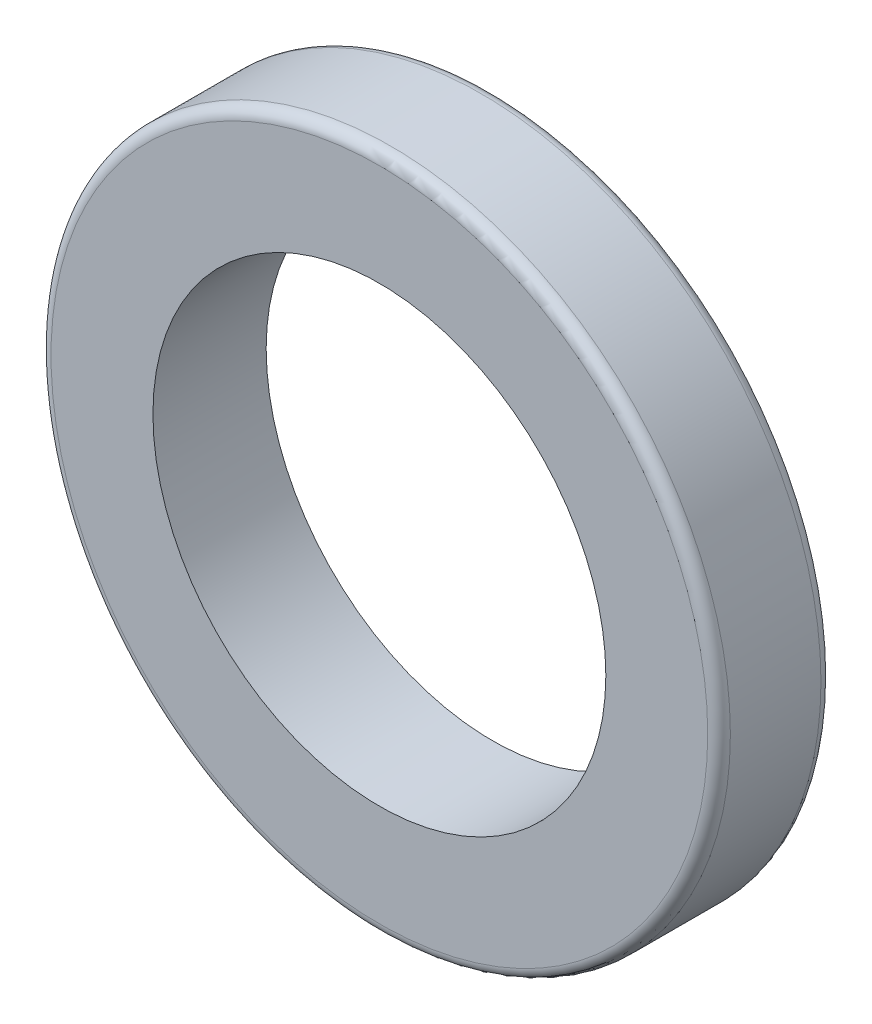
ISO-10303-21;
HEADER;
FILE_DESCRIPTION(('STEP AP214'),'2;1');
FILE_NAME('part.step','',(''),(''),'','','');
FILE_SCHEMA(('AUTOMOTIVE_DESIGN { 1 0 10303 214 1 1 1 1 }'));
ENDSEC;
DATA;
#1=APPLICATION_CONTEXT('core data for automotive mechanical design processes');
#2=APPLICATION_PROTOCOL_DEFINITION('international standard','automotive_design',2000,#1);
#3=PRODUCT_CONTEXT('',#1,'mechanical');
#4=PRODUCT('Part','Part','',(#3));
#5=PRODUCT_RELATED_PRODUCT_CATEGORY('part','',(#4));
#6=PRODUCT_DEFINITION_FORMATION('','',#4);
#7=PRODUCT_DEFINITION_CONTEXT('part definition',#1,'design');
#8=PRODUCT_DEFINITION('design','',#6,#7);
#9=PRODUCT_DEFINITION_SHAPE('','',#8);
#10=(LENGTH_UNIT() NAMED_UNIT(*) SI_UNIT(.MILLI.,.METRE.));
#11=(NAMED_UNIT(*) PLANE_ANGLE_UNIT() SI_UNIT($,.RADIAN.));
#12=(NAMED_UNIT(*) SI_UNIT($,.STERADIAN.) SOLID_ANGLE_UNIT());
#13=UNCERTAINTY_MEASURE_WITH_UNIT(LENGTH_MEASURE(1.E-05),#10,'distance_accuracy_value','');
#14=(GEOMETRIC_REPRESENTATION_CONTEXT(3) GLOBAL_UNCERTAINTY_ASSIGNED_CONTEXT((#13)) GLOBAL_UNIT_ASSIGNED_CONTEXT((#10,
#11,#12)) REPRESENTATION_CONTEXT('',''));
#15=CARTESIAN_POINT('',(0.,0.,0.));
#16=DIRECTION('',(0.,0.,1.));
#17=DIRECTION('',(1.,0.,0.));
#18=AXIS2_PLACEMENT_3D('',#15,#16,#17);
#19=CARTESIAN_POINT('',(0.,0.,2.54));
#20=DIRECTION('',(0.,0.,1.));
#21=DIRECTION('',(1.,0.,0.));
#22=AXIS2_PLACEMENT_3D('',#19,#20,#21);
#23=PLANE('',#22);
#24=CARTESIAN_POINT('',(0.,0.,2.54));
#25=DIRECTION('',(0.,0.,1.));
#26=DIRECTION('',(1.,0.,0.));
#27=AXIS2_PLACEMENT_3D('',#24,#25,#26);
#28=CIRCLE('',#27,7.366);
#29=CARTESIAN_POINT('',(7.366,0.,2.54));
#30=VERTEX_POINT('',#29);
#31=EDGE_CURVE('E10',#30,#30,#28,.T.);
#32=ORIENTED_EDGE('',*,*,#31,.T.);
#33=EDGE_LOOP('',(#32));
#34=FACE_BOUND('',#33,.T.);
#35=CARTESIAN_POINT('',(0.,0.,2.54));
#36=DIRECTION('',(0.,0.,1.));
#37=DIRECTION('',(1.,0.,0.));
#38=AXIS2_PLACEMENT_3D('',#35,#36,#37);
#39=CIRCLE('',#38,5.08);
#40=CARTESIAN_POINT('',(5.08,0.,2.54));
#41=VERTEX_POINT('',#40);
#42=EDGE_CURVE('E57',#41,#41,#39,.T.);
#43=ORIENTED_EDGE('',*,*,#42,.F.);
#44=EDGE_LOOP('',(#43));
#45=FACE_BOUND('',#44,.T.);
#46=ADVANCED_FACE('F37',(#34,#45),#23,.T.);
#47=CARTESIAN_POINT('',(0.,0.,0.));
#48=DIRECTION('',(0.,0.,1.));
#49=DIRECTION('',(1.,0.,0.));
#50=AXIS2_PLACEMENT_3D('',#47,#48,#49);
#51=PLANE('',#50);
#52=CARTESIAN_POINT('',(0.,0.,0.));
#53=DIRECTION('',(0.,0.,1.));
#54=DIRECTION('',(1.,0.,0.));
#55=AXIS2_PLACEMENT_3D('',#52,#53,#54);
#56=CIRCLE('',#55,7.366);
#57=CARTESIAN_POINT('',(7.366,0.,0.));
#58=VERTEX_POINT('',#57);
#59=EDGE_CURVE('E44',#58,#58,#56,.F.);
#60=ORIENTED_EDGE('',*,*,#59,.T.);
#61=EDGE_LOOP('',(#60));
#62=FACE_BOUND('',#61,.T.);
#63=CARTESIAN_POINT('',(0.,0.,0.));
#64=DIRECTION('',(0.,0.,1.));
#65=DIRECTION('',(1.,0.,0.));
#66=AXIS2_PLACEMENT_3D('',#63,#64,#65);
#67=CIRCLE('',#66,5.08);
#68=CARTESIAN_POINT('',(5.08,0.,0.));
#69=VERTEX_POINT('',#68);
#70=EDGE_CURVE('E58',#69,#69,#67,.T.);
#71=ORIENTED_EDGE('',*,*,#70,.T.);
#72=EDGE_LOOP('',(#71));
#73=FACE_BOUND('',#72,.T.);
#74=ADVANCED_FACE('F68',(#62,#73),#51,.F.);
#75=CARTESIAN_POINT('',(0.,0.,2.54));
#76=DIRECTION('',(0.,0.,-1.));
#77=DIRECTION('',(-1.,0.,0.));
#78=AXIS2_PLACEMENT_3D('',#75,#76,#77);
#79=CYLINDRICAL_SURFACE('',#78,7.62);
#80=CARTESIAN_POINT('',(0.,0.,0.254));
#81=DIRECTION('',(0.,0.,1.));
#82=DIRECTION('',(1.,0.,0.));
#83=AXIS2_PLACEMENT_3D('',#80,#81,#82);
#84=CIRCLE('',#83,7.62);
#85=CARTESIAN_POINT('',(7.62,0.,0.254));
#86=VERTEX_POINT('',#85);
#87=EDGE_CURVE('E48',#86,#86,#84,.T.);
#88=ORIENTED_EDGE('',*,*,#87,.T.);
#89=EDGE_LOOP('',(#88));
#90=FACE_BOUND('',#89,.T.);
#91=CARTESIAN_POINT('',(0.,0.,2.286));
#92=DIRECTION('',(0.,0.,1.));
#93=DIRECTION('',(1.,0.,0.));
#94=AXIS2_PLACEMENT_3D('',#91,#92,#93);
#95=CIRCLE('',#94,7.62);
#96=CARTESIAN_POINT('',(7.62,0.,2.286));
#97=VERTEX_POINT('',#96);
#98=EDGE_CURVE('E52',#97,#97,#95,.F.);
#99=ORIENTED_EDGE('',*,*,#98,.T.);
#100=EDGE_LOOP('',(#99));
#101=FACE_BOUND('',#100,.T.);
#102=ADVANCED_FACE('F74',(#90,#101),#79,.T.);
#103=CARTESIAN_POINT('',(0.,0.,2.54));
#104=DIRECTION('',(0.,0.,-1.));
#105=DIRECTION('',(-1.,0.,0.));
#106=AXIS2_PLACEMENT_3D('',#103,#104,#105);
#107=CYLINDRICAL_SURFACE('',#106,5.08);
#108=ORIENTED_EDGE('',*,*,#42,.T.);
#109=EDGE_LOOP('',(#108));
#110=FACE_BOUND('',#109,.T.);
#111=ORIENTED_EDGE('',*,*,#70,.F.);
#112=EDGE_LOOP('',(#111));
#113=FACE_BOUND('',#112,.T.);
#114=ADVANCED_FACE('F64',(#110,#113),#107,.F.);
#115=CARTESIAN_POINT('',(0.,0.,0.254));
#116=DIRECTION('',(0.,0.,1.));
#117=DIRECTION('',(1.,0.,0.));
#118=AXIS2_PLACEMENT_3D('',#115,#116,#117);
#119=TOROIDAL_SURFACE('',#118,7.366,0.254);
#120=ORIENTED_EDGE('',*,*,#59,.F.);
#121=EDGE_LOOP('',(#120));
#122=FACE_BOUND('',#121,.T.);
#123=ORIENTED_EDGE('',*,*,#87,.F.);
#124=EDGE_LOOP('',(#123));
#125=FACE_BOUND('',#124,.T.);
#126=ADVANCED_FACE('F80',(#122,#125),#119,.T.);
#127=CARTESIAN_POINT('',(0.,0.,2.286));
#128=DIRECTION('',(0.,0.,1.));
#129=DIRECTION('',(1.,0.,0.));
#130=AXIS2_PLACEMENT_3D('',#127,#128,#129);
#131=TOROIDAL_SURFACE('',#130,7.366,0.254);
#132=ORIENTED_EDGE('',*,*,#98,.F.);
#133=EDGE_LOOP('',(#132));
#134=FACE_BOUND('',#133,.T.);
#135=ORIENTED_EDGE('',*,*,#31,.F.);
#136=EDGE_LOOP('',(#135));
#137=FACE_BOUND('',#136,.T.);
#138=ADVANCED_FACE('F39',(#134,#137),#131,.T.);
#139=CLOSED_SHELL('',(#46,#74,#102,#114,#126,#138));
#140=MANIFOLD_SOLID_BREP('B2',#139);
#141=ADVANCED_BREP_SHAPE_REPRESENTATION('',(#18,#140),#14);
#142=SHAPE_DEFINITION_REPRESENTATION(#9,#141);
ENDSEC;
END-ISO-10303-21;
